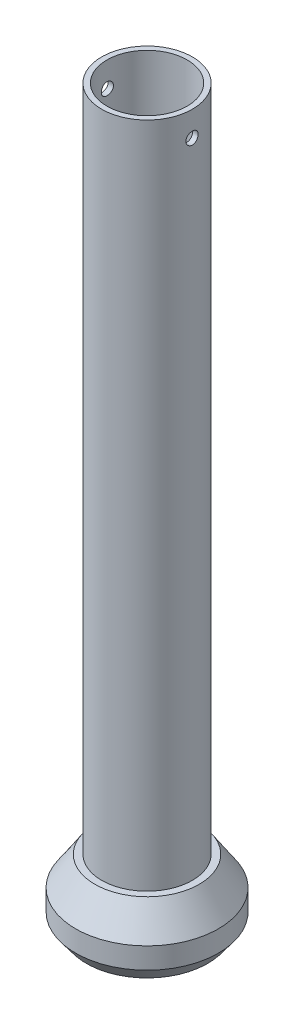
ISO-10303-21;
HEADER;
FILE_DESCRIPTION(('STEP AP214'),'2;1');
FILE_NAME('part.step','',(''),(''),'','','');
FILE_SCHEMA(('AUTOMOTIVE_DESIGN { 1 0 10303 214 1 1 1 1 }'));
ENDSEC;
DATA;
#1=APPLICATION_CONTEXT('core data for automotive mechanical design processes');
#2=APPLICATION_PROTOCOL_DEFINITION('international standard','automotive_design',2000,#1);
#3=PRODUCT_CONTEXT('',#1,'mechanical');
#4=PRODUCT('Part','Part','',(#3));
#5=PRODUCT_RELATED_PRODUCT_CATEGORY('part','',(#4));
#6=PRODUCT_DEFINITION_FORMATION('','',#4);
#7=PRODUCT_DEFINITION_CONTEXT('part definition',#1,'design');
#8=PRODUCT_DEFINITION('design','',#6,#7);
#9=PRODUCT_DEFINITION_SHAPE('','',#8);
#10=(LENGTH_UNIT() NAMED_UNIT(*) SI_UNIT(.MILLI.,.METRE.));
#11=(NAMED_UNIT(*) PLANE_ANGLE_UNIT() SI_UNIT($,.RADIAN.));
#12=(NAMED_UNIT(*) SI_UNIT($,.STERADIAN.) SOLID_ANGLE_UNIT());
#13=UNCERTAINTY_MEASURE_WITH_UNIT(LENGTH_MEASURE(1.E-05),#10,'distance_accuracy_value','');
#14=(GEOMETRIC_REPRESENTATION_CONTEXT(3) GLOBAL_UNCERTAINTY_ASSIGNED_CONTEXT((#13)) GLOBAL_UNIT_ASSIGNED_CONTEXT((#10,
#11,#12)) REPRESENTATION_CONTEXT('',''));
#15=CARTESIAN_POINT('',(0.,0.,0.));
#16=DIRECTION('',(0.,0.,1.));
#17=DIRECTION('',(1.,0.,0.));
#18=AXIS2_PLACEMENT_3D('',#15,#16,#17);
#19=CARTESIAN_POINT('',(0.,205.,0.));
#20=DIRECTION('',(0.,1.,0.));
#21=DIRECTION('',(0.,0.,1.));
#22=AXIS2_PLACEMENT_3D('',#19,#20,#21);
#23=PLANE('',#22);
#24=CARTESIAN_POINT('',(0.,205.,0.));
#25=DIRECTION('',(0.,1.,0.));
#26=DIRECTION('',(0.,0.,1.));
#27=AXIS2_PLACEMENT_3D('',#24,#25,#26);
#28=CIRCLE('',#27,12.7);
#29=CARTESIAN_POINT('',(0.,205.,12.7));
#30=VERTEX_POINT('',#29);
#31=EDGE_CURVE('E51',#30,#30,#28,.T.);
#32=ORIENTED_EDGE('',*,*,#31,.T.);
#33=EDGE_LOOP('',(#32));
#34=FACE_BOUND('',#33,.T.);
#35=CARTESIAN_POINT('',(0.,205.,0.));
#36=DIRECTION('',(0.,1.,0.));
#37=DIRECTION('',(0.,0.,1.));
#38=AXIS2_PLACEMENT_3D('',#35,#36,#37);
#39=CIRCLE('',#38,11.227);
#40=CARTESIAN_POINT('',(0.,205.,11.227));
#41=VERTEX_POINT('',#40);
#42=EDGE_CURVE('E56',#41,#41,#39,.T.);
#43=ORIENTED_EDGE('',*,*,#42,.F.);
#44=EDGE_LOOP('',(#43));
#45=FACE_BOUND('',#44,.T.);
#46=ADVANCED_FACE('F37',(#34,#45),#23,.T.);
#47=CARTESIAN_POINT('',(0.,205.,0.));
#48=DIRECTION('',(0.,-1.,0.));
#49=DIRECTION('',(0.,0.,-1.));
#50=AXIS2_PLACEMENT_3D('',#47,#48,#49);
#51=CYLINDRICAL_SURFACE('',#50,12.7);
#52=CARTESIAN_POINT('',(-12.5857061780418,198.,-1.7));
#53=CARTESIAN_POINT('',(-12.5857076261126,198.095029666816,-1.69999599546855));
#54=CARTESIAN_POINT('',(-12.586794105083,198.190117319063,-1.69200488330093));
#55=CARTESIAN_POINT('',(-12.5910205530344,198.377642239913,-1.6602554155329));
#56=CARTESIAN_POINT('',(-12.5941626200755,198.470076699774,-1.6364809500999));
#57=CARTESIAN_POINT('',(-12.6021381253762,198.649553263829,-1.57388176357468));
#58=CARTESIAN_POINT('',(-12.6069703654311,198.736599136804,-1.53506770232083));
#59=CARTESIAN_POINT('',(-12.6177803097173,198.902927202906,-1.44351474256397));
#60=CARTESIAN_POINT('',(-12.6237578308764,198.982210633796,-1.39077806907157));
#61=CARTESIAN_POINT('',(-12.6362276350666,199.131285528651,-1.27251580485948));
#62=CARTESIAN_POINT('',(-12.6427226663171,199.201020119531,-1.20691880456126));
#63=CARTESIAN_POINT('',(-12.6554710168503,199.328526010816,-1.06495187276577));
#64=CARTESIAN_POINT('',(-12.6617243236826,199.38629669567,-0.988581387304166));
#65=CARTESIAN_POINT('',(-12.6733130119551,199.488441015213,-0.826875364963607));
#66=CARTESIAN_POINT('',(-12.6786448109588,199.532762849261,-0.741506828749704));
#67=CARTESIAN_POINT('',(-12.6877594440336,199.606419341233,-0.56445456998065));
#68=CARTESIAN_POINT('',(-12.6915423436867,199.635754633716,-0.472771114997931));
#69=CARTESIAN_POINT('',(-12.6971135793965,199.67843448987,-0.28627485488713));
#70=CARTESIAN_POINT('',(-12.6989137390241,199.691873880655,-0.191484109917456));
#71=CARTESIAN_POINT('',(-12.700357092509,199.702674509539,-0.0009768645664892));
#72=CARTESIAN_POINT('',(-12.700000382947,199.700036467558,0.0947395941713518));
#73=CARTESIAN_POINT('',(-12.6971797154939,199.678832721595,0.283735457543321));
#74=CARTESIAN_POINT('',(-12.6947292519761,199.660369012618,0.377026534973739));
#75=CARTESIAN_POINT('',(-12.6880115065981,199.608197709311,0.559174076179373));
#76=CARTESIAN_POINT('',(-12.6837441859857,199.574489789831,0.648030445320119));
#77=CARTESIAN_POINT('',(-12.6738489440843,199.492679804065,0.819099667713063));
#78=CARTESIAN_POINT('',(-12.6682168987378,199.444534001182,0.901291356683168));
#79=CARTESIAN_POINT('',(-12.6562215197963,199.335246783316,1.05646725720112));
#80=CARTESIAN_POINT('',(-12.6498581477781,199.274104685374,1.1294509845466));
#81=CARTESIAN_POINT('',(-12.6370525797161,199.139990226847,1.26473912878109));
#82=CARTESIAN_POINT('',(-12.6306101567354,199.066928919368,1.32695538198785));
#83=CARTESIAN_POINT('',(-12.6184216054738,198.911354407539,1.43825619734592));
#84=CARTESIAN_POINT('',(-12.6126754799944,198.828841165165,1.48734070666658));
#85=CARTESIAN_POINT('',(-12.6025302682549,198.656622034751,1.57099202270723));
#86=CARTESIAN_POINT('',(-12.5981318993661,198.566912348197,1.60555110159179));
#87=CARTESIAN_POINT('',(-12.5911937330922,198.382890685124,1.65908887825643));
#88=CARTESIAN_POINT('',(-12.5886538324654,198.288578964567,1.67806844151632));
#89=CARTESIAN_POINT('',(-12.5857393159955,198.098810969687,1.69979028597622));
#90=CARTESIAN_POINT('',(-12.5853481150033,198.003369177263,1.70265694176305));
#91=CARTESIAN_POINT('',(-12.5867313734562,197.813366659363,1.69240038418018));
#92=CARTESIAN_POINT('',(-12.5885057797721,197.71880591233,1.67927756308177));
#93=CARTESIAN_POINT('',(-12.5940051558249,197.533626631206,1.63751954099806));
#94=CARTESIAN_POINT('',(-12.5977224780065,197.442994138946,1.60894514416265));
#95=CARTESIAN_POINT('',(-12.6066826059145,197.267806255241,1.53715790190023));
#96=CARTESIAN_POINT('',(-12.6119254726155,197.18325110687,1.49394447135366));
#97=CARTESIAN_POINT('',(-12.6233854657903,197.022057134718,1.39380236985674));
#98=CARTESIAN_POINT('',(-12.6296082819452,196.945469175123,1.33679248719701));
#99=CARTESIAN_POINT('',(-12.6423094086052,196.802903912302,1.21078994456793));
#100=CARTESIAN_POINT('',(-12.6487877305313,196.73692708406,1.14179674848011));
#101=CARTESIAN_POINT('',(-12.6613211770068,196.617016757267,0.993241233798258));
#102=CARTESIAN_POINT('',(-12.6673732419207,196.563165220929,0.91361246189713));
#103=CARTESIAN_POINT('',(-12.6783259415851,196.469602550646,0.74636732792761));
#104=CARTESIAN_POINT('',(-12.6832266024078,196.429891096507,0.658751146786749));
#105=CARTESIAN_POINT('',(-12.6913108048035,196.365869742668,0.478285126969215));
#106=CARTESIAN_POINT('',(-12.6944995274523,196.341513332428,0.38545202993557));
#107=CARTESIAN_POINT('',(-12.6988221676126,196.308742392541,0.196968172328185));
#108=CARTESIAN_POINT('',(-12.6999561920936,196.300327032986,0.101317558700326));
#109=CARTESIAN_POINT('',(-12.7000409696867,196.299694168376,-0.0892876883330756));
#110=CARTESIAN_POINT('',(-12.6990087128469,196.307350612995,-0.18424192012823));
#111=CARTESIAN_POINT('',(-12.6949108372525,196.338375975885,-0.371500721255274));
#112=CARTESIAN_POINT('',(-12.6918452214441,196.361744871388,-0.46380529442634));
#113=CARTESIAN_POINT('',(-12.6840234739014,196.423490432774,-0.64312196229775));
#114=CARTESIAN_POINT('',(-12.6792681251201,196.461860148715,-0.730136486358439));
#115=CARTESIAN_POINT('',(-12.6685920444935,196.55250504872,-0.896511854786507));
#116=CARTESIAN_POINT('',(-12.6626712906356,196.604780495448,-0.975872554543088));
#117=CARTESIAN_POINT('',(-12.6502690336374,196.722215967273,-1.12533009996931));
#118=CARTESIAN_POINT('',(-12.6437836617612,196.787469587731,-1.19535308777107));
#119=CARTESIAN_POINT('',(-12.6310133503666,196.928813267282,-1.32350300214569));
#120=CARTESIAN_POINT('',(-12.6247284585022,197.004905879654,-1.38162711788447));
#121=CARTESIAN_POINT('',(-12.6130409811272,197.166158264974,-1.48455393730156));
#122=CARTESIAN_POINT('',(-12.6076424278439,197.251356714549,-1.52929648246331));
#123=CARTESIAN_POINT('',(-12.5983860699093,197.428085594883,-1.60377348439465));
#124=CARTESIAN_POINT('',(-12.5945266159548,197.519609123555,-1.63352401571545));
#125=CARTESIAN_POINT('',(-12.5897075098459,197.676321974686,-1.6701727269858));
#126=CARTESIAN_POINT('',(-12.5882146420675,197.740529188185,-1.68134153185223));
#127=CARTESIAN_POINT('',(-12.586213484658,197.869815200767,-1.69625650592259));
#128=CARTESIAN_POINT('',(-12.5857051859505,197.934893991809,-1.70000274355436));
#129=CARTESIAN_POINT('',(-12.5857061780418,198.,-1.7));
#130=B_SPLINE_CURVE_WITH_KNOTS('',3,(#52,#53,#54,#55,#56,#57,#58,#59,#60,#61,#62,#63,#64,#65,
#66,#67,#68,#69,#70,#71,#72,#73,#74,#75,#76,#77,#78,#79,#80,#81,#82,#83,#84,#85,#86,#87,#88,#89,
#90,#91,#92,#93,#94,#95,#96,#97,#98,#99,#100,#101,#102,#103,#104,#105,#106,#107,#108,#109,#110,
#111,#112,#113,#114,#115,#116,#117,#118,#119,#120,#121,#122,#123,#124,#125,#126,#127,#128,#129),
.UNSPECIFIED.,.T.,.F.,(4,2,2,2,2,2,2,2,2,2,2,2,2,2,2,2,2,2,2,2,2,2,2,2,2,2,2,2,2,2,2,2,2,2,2,2,
2,2,4),(0.,0.284851116940149,0.569993425080827,0.854933997268417,1.1398290598633,
1.42635331147528,1.71289230131793,2.00052133305377,2.28813818501126,2.5740304611665,
2.85990993566352,3.14396067861157,3.42801748047186,3.71294361897851,3.99788473413996,
4.28505862843808,4.57223367805557,4.8595613180565,5.1468729952308,5.43196385260401,
5.71704771595802,6.00101781204263,6.28499925970048,6.57069483930796,6.85640320387246,
7.14398844343264,7.43156717034728,7.71827058024368,8.00495906367925,8.28940746822011,
8.57385546059371,8.85817182292123,9.14249355604939,9.42894538821395,9.71546481013103,
10.0032535955277,10.290733151532,10.4858899982897,10.6810450459092),.UNSPECIFIED.);
#131=CARTESIAN_POINT('',(-12.5857061780418,198.,-1.7));
#132=VERTEX_POINT('',#131);
#133=EDGE_CURVE('E86',#132,#132,#130,.T.);
#134=ORIENTED_EDGE('',*,*,#133,.T.);
#135=EDGE_LOOP('',(#134));
#136=FACE_BOUND('',#135,.T.);
#137=CARTESIAN_POINT('',(12.5857061780418,198.,-1.7));
#138=CARTESIAN_POINT('',(12.5857076261126,197.904970333184,-1.69999599546855));
#139=CARTESIAN_POINT('',(12.586794105083,197.809882680937,-1.69200488330093));
#140=CARTESIAN_POINT('',(12.5910205530343,197.622357760087,-1.6602554155329));
#141=CARTESIAN_POINT('',(12.5941626200755,197.529923300226,-1.6364809500999));
#142=CARTESIAN_POINT('',(12.6021381253762,197.350446736171,-1.57388176357468));
#143=CARTESIAN_POINT('',(12.6069703654311,197.263400863196,-1.53506770232083));
#144=CARTESIAN_POINT('',(12.6177803097173,197.097072797094,-1.44351474256397));
#145=CARTESIAN_POINT('',(12.6237578308764,197.017789366204,-1.39077806907157));
#146=CARTESIAN_POINT('',(12.6362276350666,196.868714471349,-1.27251580485948));
#147=CARTESIAN_POINT('',(12.6427226663171,196.798979880469,-1.20691880456126));
#148=CARTESIAN_POINT('',(12.6554710168503,196.671473989184,-1.06495187276577));
#149=CARTESIAN_POINT('',(12.6617243236826,196.61370330433,-0.988581387304165));
#150=CARTESIAN_POINT('',(12.6733130119551,196.511558984787,-0.826875364963607));
#151=CARTESIAN_POINT('',(12.6786448109588,196.467237150739,-0.741506828749704));
#152=CARTESIAN_POINT('',(12.6877594440336,196.393580658767,-0.56445456998065));
#153=CARTESIAN_POINT('',(12.6915423436867,196.364245366283,-0.472771114997931));
#154=CARTESIAN_POINT('',(12.6971135793965,196.32156551013,-0.286274854887131));
#155=CARTESIAN_POINT('',(12.6989137390241,196.308126119345,-0.191484109917458));
#156=CARTESIAN_POINT('',(12.700357092509,196.297325490461,-0.000976864566491463));
#157=CARTESIAN_POINT('',(12.700000382947,196.299963532442,0.0947395941713504));
#158=CARTESIAN_POINT('',(12.6971797154939,196.321167278405,0.283735457543321));
#159=CARTESIAN_POINT('',(12.6947292519761,196.339630987382,0.377026534973739));
#160=CARTESIAN_POINT('',(12.6880115065981,196.391802290689,0.559174076179373));
#161=CARTESIAN_POINT('',(12.6837441859857,196.425510210169,0.648030445320117));
#162=CARTESIAN_POINT('',(12.6738489440843,196.507320195935,0.819099667713058));
#163=CARTESIAN_POINT('',(12.6682168987378,196.555465998818,0.901291356683161));
#164=CARTESIAN_POINT('',(12.6562215197963,196.664753216683,1.05646725720112));
#165=CARTESIAN_POINT('',(12.6498581477781,196.725895314626,1.12945098454659));
#166=CARTESIAN_POINT('',(12.6370525797161,196.860009773152,1.26473912878109));
#167=CARTESIAN_POINT('',(12.6306101567354,196.933071080632,1.32695538198785));
#168=CARTESIAN_POINT('',(12.6184216054738,197.088645592461,1.43825619734592));
#169=CARTESIAN_POINT('',(12.6126754799944,197.171158834835,1.48734070666658));
#170=CARTESIAN_POINT('',(12.6025302682549,197.343377965249,1.57099202270722));
#171=CARTESIAN_POINT('',(12.5981318993661,197.433087651803,1.60555110159179));
#172=CARTESIAN_POINT('',(12.5911937330922,197.617109314876,1.65908887825642));
#173=CARTESIAN_POINT('',(12.5886538324654,197.711421035432,1.67806844151632));
#174=CARTESIAN_POINT('',(12.5857393159955,197.901189030312,1.69979028597622));
#175=CARTESIAN_POINT('',(12.5853481150033,197.996630822737,1.70265694176305));
#176=CARTESIAN_POINT('',(12.5867313734562,198.186633340637,1.69240038418018));
#177=CARTESIAN_POINT('',(12.5885057797721,198.28119408767,1.67927756308177));
#178=CARTESIAN_POINT('',(12.5940051558249,198.466373368794,1.63751954099806));
#179=CARTESIAN_POINT('',(12.5977224780065,198.557005861054,1.60894514416265));
#180=CARTESIAN_POINT('',(12.6066826059145,198.732193744759,1.53715790190023));
#181=CARTESIAN_POINT('',(12.6119254726155,198.81674889313,1.49394447135366));
#182=CARTESIAN_POINT('',(12.6233854657903,198.977942865282,1.39380236985674));
#183=CARTESIAN_POINT('',(12.6296082819452,199.054530824877,1.33679248719701));
#184=CARTESIAN_POINT('',(12.6423094086052,199.197096087698,1.21078994456793));
#185=CARTESIAN_POINT('',(12.6487877305313,199.26307291594,1.14179674848011));
#186=CARTESIAN_POINT('',(12.6613211770068,199.382983242733,0.993241233798258));
#187=CARTESIAN_POINT('',(12.6673732419207,199.436834779071,0.91361246189713));
#188=CARTESIAN_POINT('',(12.6783259415851,199.530397449354,0.74636732792761));
#189=CARTESIAN_POINT('',(12.6832266024078,199.570108903493,0.658751146786749));
#190=CARTESIAN_POINT('',(12.6913108048035,199.634130257332,0.478285126969215));
#191=CARTESIAN_POINT('',(12.6944995274523,199.658486667572,0.38545202993557));
#192=CARTESIAN_POINT('',(12.6988221676126,199.691257607459,0.196968172328185));
#193=CARTESIAN_POINT('',(12.6999561920936,199.699672967014,0.101317558700326));
#194=CARTESIAN_POINT('',(12.7000409696867,199.700305831624,-0.0892876883330755));
#195=CARTESIAN_POINT('',(12.6990087128469,199.692649387005,-0.18424192012823));
#196=CARTESIAN_POINT('',(12.6949108372525,199.661624024115,-0.371500721255274));
#197=CARTESIAN_POINT('',(12.6918452214441,199.638255128612,-0.463805294426339));
#198=CARTESIAN_POINT('',(12.6840234739014,199.576509567226,-0.64312196229775));
#199=CARTESIAN_POINT('',(12.6792681251201,199.538139851284,-0.730136486358439));
#200=CARTESIAN_POINT('',(12.6685920444935,199.447494951279,-0.896511854786506));
#201=CARTESIAN_POINT('',(12.6626712906356,199.395219504552,-0.975872554543086));
#202=CARTESIAN_POINT('',(12.6502690336374,199.277784032727,-1.1253300999693));
#203=CARTESIAN_POINT('',(12.6437836617612,199.212530412269,-1.19535308777106));
#204=CARTESIAN_POINT('',(12.6310133503666,199.071186732718,-1.32350300214568));
#205=CARTESIAN_POINT('',(12.6247284585022,198.995094120346,-1.38162711788447));
#206=CARTESIAN_POINT('',(12.6130409811272,198.833841735026,-1.48455393730156));
#207=CARTESIAN_POINT('',(12.6076424278439,198.748643285451,-1.52929648246331));
#208=CARTESIAN_POINT('',(12.5983860699093,198.571914405117,-1.60377348439465));
#209=CARTESIAN_POINT('',(12.5945266159548,198.480390876445,-1.63352401571545));
#210=CARTESIAN_POINT('',(12.5897075098459,198.323678025314,-1.6701727269858));
#211=CARTESIAN_POINT('',(12.5882146420675,198.259470811815,-1.68134153185223));
#212=CARTESIAN_POINT('',(12.586213484658,198.130184799233,-1.69625650592259));
#213=CARTESIAN_POINT('',(12.5857051859505,198.065106008191,-1.70000274355436));
#214=CARTESIAN_POINT('',(12.5857061780418,198.,-1.7));
#215=B_SPLINE_CURVE_WITH_KNOTS('',3,(#137,#138,#139,#140,#141,#142,#143,#144,#145,#146,#147,
#148,#149,#150,#151,#152,#153,#154,#155,#156,#157,#158,#159,#160,#161,#162,#163,#164,#165,#166,
#167,#168,#169,#170,#171,#172,#173,#174,#175,#176,#177,#178,#179,#180,#181,#182,#183,#184,#185,
#186,#187,#188,#189,#190,#191,#192,#193,#194,#195,#196,#197,#198,#199,#200,#201,#202,#203,#204,
#205,#206,#207,#208,#209,#210,#211,#212,#213,#214),.UNSPECIFIED.,.T.,.F.,(4,2,2,2,2,2,2,2,2,2,2,
2,2,2,2,2,2,2,2,2,2,2,2,2,2,2,2,2,2,2,2,2,2,2,2,2,2,2,4),(0.,0.284851116940149,
0.569993425080826,0.854933997268417,1.1398290598633,1.42635331147528,1.71289230131793,
2.00052133305377,2.28813818501126,2.5740304611665,2.85990993566352,3.14396067861157,
3.42801748047186,3.71294361897848,3.99788473413996,4.28505862843808,4.57223367805557,
4.85956131805647,5.14687299523081,5.43196385260402,5.71704771595802,6.00101781204264,
6.28499925970048,6.57069483930797,6.85640320387246,7.14398844343265,7.43156717034729,
7.71827058024369,8.00495906367925,8.28940746822011,8.57385546059372,8.85817182292123,
9.14249355604939,9.42894538821392,9.71546481013103,10.0032535955277,10.290733151532,
10.4858899982897,10.6810450459092),.UNSPECIFIED.);
#216=CARTESIAN_POINT('',(12.5857061780418,198.,-1.7));
#217=VERTEX_POINT('',#216);
#218=EDGE_CURVE('E81',#217,#217,#215,.T.);
#219=ORIENTED_EDGE('',*,*,#218,.T.);
#220=EDGE_LOOP('',(#219));
#221=FACE_BOUND('',#220,.T.);
#222=CARTESIAN_POINT('',(0.,18.,0.));
#223=DIRECTION('',(0.,1.,0.));
#224=DIRECTION('',(0.,0.,1.));
#225=AXIS2_PLACEMENT_3D('',#222,#223,#224);
#226=CIRCLE('',#225,12.7);
#227=CARTESIAN_POINT('',(0.,18.,12.7));
#228=VERTEX_POINT('',#227);
#229=EDGE_CURVE('E104',#228,#228,#226,.T.);
#230=ORIENTED_EDGE('',*,*,#229,.T.);
#231=EDGE_LOOP('',(#230));
#232=FACE_BOUND('',#231,.T.);
#233=ORIENTED_EDGE('',*,*,#31,.F.);
#234=EDGE_LOOP('',(#233));
#235=FACE_BOUND('',#234,.T.);
#236=ADVANCED_FACE('F39',(#136,#221,#232,#235),#51,.T.);
#237=CARTESIAN_POINT('',(0.,205.,0.));
#238=DIRECTION('',(0.,-1.,0.));
#239=DIRECTION('',(0.,0.,-1.));
#240=AXIS2_PLACEMENT_3D('',#237,#238,#239);
#241=CYLINDRICAL_SURFACE('',#240,11.227);
#242=CARTESIAN_POINT('',(-11.0975460801026,198.,-1.7));
#243=CARTESIAN_POINT('',(-11.0975476780079,198.094900607206,-1.69999608833353));
#244=CARTESIAN_POINT('',(-11.0987765667018,198.18985603763,-1.69202654393414));
#245=CARTESIAN_POINT('',(-11.1035559209667,198.377111278822,-1.66036783735331));
#246=CARTESIAN_POINT('',(-11.1071086408957,198.469408419906,-1.63666341036773));
#247=CARTESIAN_POINT('',(-11.1161242508861,198.648609541566,-1.5742610433209));
#248=CARTESIAN_POINT('',(-11.121585664094,198.735517630889,-1.53557469304523));
#249=CARTESIAN_POINT('',(-11.1338015445046,198.901596842924,-1.4443340638145));
#250=CARTESIAN_POINT('',(-11.140555836312,198.980769012913,-1.391781665598));
#251=CARTESIAN_POINT('',(-11.154658027372,199.129786756436,-1.27384299149691));
#252=CARTESIAN_POINT('',(-11.1620098973089,199.199560084195,-1.20836589497708));
#253=CARTESIAN_POINT('',(-11.1764434477108,199.327173349079,-1.06663260111831));
#254=CARTESIAN_POINT('',(-11.1835251132103,199.385012626004,-0.990375807832299));
#255=CARTESIAN_POINT('',(-11.1966619235425,199.487382881499,-0.828784508643873));
#256=CARTESIAN_POINT('',(-11.2027118694016,199.531847273453,-0.743407360539824));
#257=CARTESIAN_POINT('',(-11.2130595804229,199.605778212158,-0.566289670144371));
#258=CARTESIAN_POINT('',(-11.2173574398896,199.635245566131,-0.474549470649573));
#259=CARTESIAN_POINT('',(-11.2236887124903,199.678126791215,-0.28805407071714));
#260=CARTESIAN_POINT('',(-11.2257391869926,199.691661675119,-0.19332728355773));
#261=CARTESIAN_POINT('',(-11.2274031427348,199.702669551904,-0.00292643326980734));
#262=CARTESIAN_POINT('',(-11.227016761904,199.70014345386,0.0927475759385745));
#263=CARTESIAN_POINT('',(-11.2238641636252,199.67919648073,0.281501269245245));
#264=CARTESIAN_POINT('',(-11.2211174400345,199.660905800225,0.374595773550772));
#265=CARTESIAN_POINT('',(-11.2135744993549,199.609153283949,0.556378762110231));
#266=CARTESIAN_POINT('',(-11.208778228703,199.575691051681,0.645067131146008));
#267=CARTESIAN_POINT('',(-11.1976416289034,199.494412334356,0.815913818317857));
#268=CARTESIAN_POINT('',(-11.1912954319102,199.446541134612,0.898045708390201));
#269=CARTESIAN_POINT('',(-11.1777660782417,199.337843328927,1.05315985724655));
#270=CARTESIAN_POINT('',(-11.1705828654555,199.277015854213,1.12614150194563));
#271=CARTESIAN_POINT('',(-11.1560954199135,199.143407143393,1.26165107676896));
#272=CARTESIAN_POINT('',(-11.1487906957586,199.07051222669,1.32406692106415));
#273=CARTESIAN_POINT('',(-11.134953685821,198.915223822377,1.43579763058257));
#274=CARTESIAN_POINT('',(-11.1284214049685,198.832830274148,1.48511241218976));
#275=CARTESIAN_POINT('',(-11.1168689842971,198.660765551837,1.56925683744556));
#276=CARTESIAN_POINT('',(-11.1118500649074,198.571088577715,1.60407479890779));
#277=CARTESIAN_POINT('',(-11.1039141032747,198.387066712189,1.65812360717463));
#278=CARTESIAN_POINT('',(-11.1009969099352,198.292722156865,1.67735557449415));
#279=CARTESIAN_POINT('',(-11.0976233963631,198.103040927125,1.69953241165985));
#280=CARTESIAN_POINT('',(-11.0971430591578,198.007723250336,1.70263624331223));
#281=CARTESIAN_POINT('',(-11.0986338623088,197.817929034249,1.69289064866793));
#282=CARTESIAN_POINT('',(-11.1006049250986,197.723452468433,1.68004172714399));
#283=CARTESIAN_POINT('',(-11.1067543658382,197.538515804464,1.63889023881176));
#284=CARTESIAN_POINT('',(-11.110921408357,197.448037642868,1.6106670077021));
#285=CARTESIAN_POINT('',(-11.1209839249317,197.273096164823,1.5396506369624));
#286=CARTESIAN_POINT('',(-11.1268794858371,197.188633150868,1.49685676521379));
#287=CARTESIAN_POINT('',(-11.1397912755189,197.02740739992,1.39753249813958));
#288=CARTESIAN_POINT('',(-11.1468157510136,196.950708675671,1.34089928626849));
#289=CARTESIAN_POINT('',(-11.1611691078928,196.807847044078,1.21564673104491));
#290=CARTESIAN_POINT('',(-11.1684980068098,196.741684744618,1.14702669660692));
#291=CARTESIAN_POINT('',(-11.1827095618661,196.621202402332,0.999047960914396));
#292=CARTESIAN_POINT('',(-11.1895878971168,196.566987760573,0.91960296709246));
#293=CARTESIAN_POINT('',(-11.2020560000026,196.472674351277,0.752640911062378));
#294=CARTESIAN_POINT('',(-11.2076458034326,196.432575191602,0.665124073180394));
#295=CARTESIAN_POINT('',(-11.2168881027707,196.367799068304,0.484830385695954));
#296=CARTESIAN_POINT('',(-11.2205478048291,196.343064676943,0.392074553827564));
#297=CARTESIAN_POINT('',(-11.2255478186098,196.309534430511,0.203666383805654));
#298=CARTESIAN_POINT('',(-11.2268882865612,196.300737501852,0.108014241196315));
#299=CARTESIAN_POINT('',(-11.2270971797654,196.299358478704,-0.0824494664253017));
#300=CARTESIAN_POINT('',(-11.2259901806362,196.306615186159,-0.177259876717656));
#301=CARTESIAN_POINT('',(-11.221478129754,196.336791668163,-0.364295710816036));
#302=CARTESIAN_POINT('',(-11.218073085768,196.359711389774,-0.456521143357784));
#303=CARTESIAN_POINT('',(-11.2093457995206,196.420505719045,-0.635723397712592));
#304=CARTESIAN_POINT('',(-11.2040250152027,196.458368956282,-0.722704152293476));
#305=CARTESIAN_POINT('',(-11.1920503713569,196.547958263247,-0.889103306289192));
#306=CARTESIAN_POINT('',(-11.1853964668985,196.599684800233,-0.968521450686062));
#307=CARTESIAN_POINT('',(-11.1714156986471,196.716114325478,-1.11835815241303));
#308=CARTESIAN_POINT('',(-11.1640830270465,196.780936255532,-1.18868375358987));
#309=CARTESIAN_POINT('',(-11.1496138901503,196.921466280419,-1.31751773337707));
#310=CARTESIAN_POINT('',(-11.1424774712945,196.99717692592,-1.37602333542433));
#311=CARTESIAN_POINT('',(-11.1291649408665,197.157846143617,-1.47985839424944));
#312=CARTESIAN_POINT('',(-11.1229945702165,197.242855253219,-1.5251103769619));
#313=CARTESIAN_POINT('',(-11.1123801217587,197.419321262151,-1.60062607285991));
#314=CARTESIAN_POINT('',(-11.1079342589065,197.510771377854,-1.63090529337883));
#315=CARTESIAN_POINT('',(-11.1022960145512,197.668856533695,-1.66876813992151));
#316=CARTESIAN_POINT('',(-11.1005242705366,197.734516687861,-1.68046209689796));
#317=CARTESIAN_POINT('',(-11.0981487501953,197.866775562523,-1.69607934819052));
#318=CARTESIAN_POINT('',(-11.0975449582804,197.933374270479,-1.7000027462167));
#319=CARTESIAN_POINT('',(-11.0975460801026,198.,-1.7));
#320=B_SPLINE_CURVE_WITH_KNOTS('',3,(#242,#243,#244,#245,#246,#247,#248,#249,#250,#251,#252,
#253,#254,#255,#256,#257,#258,#259,#260,#261,#262,#263,#264,#265,#266,#267,#268,#269,#270,#271,
#272,#273,#274,#275,#276,#277,#278,#279,#280,#281,#282,#283,#284,#285,#286,#287,#288,#289,#290,
#291,#292,#293,#294,#295,#296,#297,#298,#299,#300,#301,#302,#303,#304,#305,#306,#307,#308,#309,
#310,#311,#312,#313,#314,#315,#316,#317,#318,#319),.UNSPECIFIED.,.T.,.F.,(4,2,2,2,2,2,2,2,2,2,2,
2,2,2,2,2,2,2,2,2,2,2,2,2,2,2,2,2,2,2,2,2,2,2,2,2,2,2,4),(0.,0.284458287792611,
0.569192939803246,0.853707764045108,1.13818401758704,1.42473538819387,1.71130260676804,
1.99927374105228,2.28722937350229,2.57298347133351,2.85872139522949,3.14212187033808,
3.42552975232583,3.71002768526764,3.99454470102951,4.28191286912159,4.56928287126448,
4.85688400289565,5.14446445634956,5.42920501421058,5.71393656261686,5.99721254710745,
6.28050276722631,6.56596528028133,6.85144425676124,7.13934896044924,7.4272456653321,
7.71405974181402,8.00085449705531,8.28478256700812,8.56870967733327,8.85242116461984,
9.13614221552552,9.42256651438614,9.7090580173824,9.99719223073263,10.2850273943128,
10.4847362734486,10.6844424871442),.UNSPECIFIED.);
#321=CARTESIAN_POINT('',(-11.0975460801026,198.,-1.7));
#322=VERTEX_POINT('',#321);
#323=EDGE_CURVE('E42',#322,#322,#320,.T.);
#324=ORIENTED_EDGE('',*,*,#323,.F.);
#325=EDGE_LOOP('',(#324));
#326=FACE_BOUND('',#325,.T.);
#327=CARTESIAN_POINT('',(11.0975460801026,198.,-1.7));
#328=CARTESIAN_POINT('',(11.0975476780079,197.905099392794,-1.69999608833353));
#329=CARTESIAN_POINT('',(11.0987765667018,197.81014396237,-1.69202654393414));
#330=CARTESIAN_POINT('',(11.1035559209667,197.622888721178,-1.6603678373533));
#331=CARTESIAN_POINT('',(11.1071086408957,197.530591580094,-1.63666341036772));
#332=CARTESIAN_POINT('',(11.1161242508861,197.351390458434,-1.57426104332089));
#333=CARTESIAN_POINT('',(11.121585664094,197.264482369111,-1.53557469304522));
#334=CARTESIAN_POINT('',(11.1338015445046,197.098403157076,-1.44433406381448));
#335=CARTESIAN_POINT('',(11.140555836312,197.019230987087,-1.39178166559799));
#336=CARTESIAN_POINT('',(11.154658027372,196.870213243564,-1.27384299149691));
#337=CARTESIAN_POINT('',(11.1620098973089,196.800439915804,-1.20836589497708));
#338=CARTESIAN_POINT('',(11.1764434477108,196.672826650921,-1.06663260111831));
#339=CARTESIAN_POINT('',(11.1835251132103,196.614987373996,-0.990375807832298));
#340=CARTESIAN_POINT('',(11.1966619235425,196.512617118501,-0.828784508643873));
#341=CARTESIAN_POINT('',(11.2027118694016,196.468152726547,-0.743407360539824));
#342=CARTESIAN_POINT('',(11.2130595804229,196.394221787842,-0.566289670144371));
#343=CARTESIAN_POINT('',(11.2173574398896,196.364754433869,-0.474549470649573));
#344=CARTESIAN_POINT('',(11.2236887124903,196.321873208785,-0.28805407071714));
#345=CARTESIAN_POINT('',(11.2257391869926,196.308338324881,-0.19332728355773));
#346=CARTESIAN_POINT('',(11.2274031427348,196.297330448096,-0.00292643326980703));
#347=CARTESIAN_POINT('',(11.227016761904,196.29985654614,0.0927475759385749));
#348=CARTESIAN_POINT('',(11.2238641636252,196.32080351927,0.281501269245243));
#349=CARTESIAN_POINT('',(11.2211174400345,196.339094199775,0.374595773550767));
#350=CARTESIAN_POINT('',(11.2135744993549,196.390846716051,0.556378762110226));
#351=CARTESIAN_POINT('',(11.208778228703,196.424308948319,0.645067131146006));
#352=CARTESIAN_POINT('',(11.1976416289034,196.505587665644,0.815913818317858));
#353=CARTESIAN_POINT('',(11.1912954319102,196.553458865388,0.898045708390201));
#354=CARTESIAN_POINT('',(11.1777660782417,196.662156671073,1.05315985724655));
#355=CARTESIAN_POINT('',(11.1705828654555,196.722984145787,1.12614150194563));
#356=CARTESIAN_POINT('',(11.1560954199135,196.856592856607,1.26165107676896));
#357=CARTESIAN_POINT('',(11.1487906957586,196.92948777331,1.32406692106414));
#358=CARTESIAN_POINT('',(11.134953685821,197.084776177623,1.43579763058257));
#359=CARTESIAN_POINT('',(11.1284214049685,197.167169725852,1.48511241218977));
#360=CARTESIAN_POINT('',(11.1168689842971,197.339234448163,1.56925683744557));
#361=CARTESIAN_POINT('',(11.1118500649074,197.428911422285,1.60407479890779));
#362=CARTESIAN_POINT('',(11.1039141032747,197.612933287811,1.65812360717463));
#363=CARTESIAN_POINT('',(11.1009969099352,197.707277843135,1.67735557449415));
#364=CARTESIAN_POINT('',(11.0976233963631,197.896959072875,1.69953241165985));
#365=CARTESIAN_POINT('',(11.0971430591578,197.992276749664,1.70263624331223));
#366=CARTESIAN_POINT('',(11.0986338623088,198.182070965751,1.69289064866793));
#367=CARTESIAN_POINT('',(11.1006049250986,198.276547531567,1.68004172714399));
#368=CARTESIAN_POINT('',(11.1067543658382,198.461484195536,1.63889023881176));
#369=CARTESIAN_POINT('',(11.110921408357,198.551962357132,1.6106670077021));
#370=CARTESIAN_POINT('',(11.1209839249317,198.726903835177,1.5396506369624));
#371=CARTESIAN_POINT('',(11.1268794858371,198.811366849132,1.49685676521379));
#372=CARTESIAN_POINT('',(11.1397912755189,198.97259260008,1.39753249813958));
#373=CARTESIAN_POINT('',(11.1468157510136,199.049291324329,1.34089928626849));
#374=CARTESIAN_POINT('',(11.1611691078928,199.192152955922,1.21564673104491));
#375=CARTESIAN_POINT('',(11.1684980068098,199.258315255382,1.14702669660692));
#376=CARTESIAN_POINT('',(11.1827095618661,199.378797597668,0.999047960914399));
#377=CARTESIAN_POINT('',(11.1895878971168,199.433012239427,0.919602967092466));
#378=CARTESIAN_POINT('',(11.2020560000026,199.527325648723,0.752640911062382));
#379=CARTESIAN_POINT('',(11.2076458034326,199.567424808398,0.66512407318039));
#380=CARTESIAN_POINT('',(11.2168881027707,199.632200931696,0.484830385695944));
#381=CARTESIAN_POINT('',(11.2205478048291,199.656935323056,0.392074553827556));
#382=CARTESIAN_POINT('',(11.2255478186098,199.690465569489,0.20366638380565));
#383=CARTESIAN_POINT('',(11.2268882865612,199.699262498148,0.108014241196312));
#384=CARTESIAN_POINT('',(11.2270971797654,199.700641521296,-0.0824494664253022));
#385=CARTESIAN_POINT('',(11.2259901806362,199.693384813841,-0.177259876717655));
#386=CARTESIAN_POINT('',(11.221478129754,199.663208331837,-0.364295710816034));
#387=CARTESIAN_POINT('',(11.218073085768,199.640288610226,-0.456521143357783));
#388=CARTESIAN_POINT('',(11.2093457995206,199.579494280955,-0.635723397712592));
#389=CARTESIAN_POINT('',(11.2040250152027,199.541631043718,-0.722704152293476));
#390=CARTESIAN_POINT('',(11.1920503713569,199.452041736753,-0.889103306289192));
#391=CARTESIAN_POINT('',(11.1853964668985,199.400315199767,-0.968521450686062));
#392=CARTESIAN_POINT('',(11.1714156986471,199.283885674522,-1.11835815241303));
#393=CARTESIAN_POINT('',(11.1640830270465,199.219063744468,-1.18868375358987));
#394=CARTESIAN_POINT('',(11.1496138901503,199.078533719581,-1.31751773337707));
#395=CARTESIAN_POINT('',(11.1424774712945,199.00282307408,-1.37602333542433));
#396=CARTESIAN_POINT('',(11.1291649408665,198.842153856383,-1.47985839424944));
#397=CARTESIAN_POINT('',(11.1229945702165,198.757144746781,-1.5251103769619));
#398=CARTESIAN_POINT('',(11.1123801217587,198.580678737849,-1.60062607285991));
#399=CARTESIAN_POINT('',(11.1079342589065,198.489228622146,-1.63090529337883));
#400=CARTESIAN_POINT('',(11.1022960145512,198.331143466305,-1.66876813992151));
#401=CARTESIAN_POINT('',(11.1005242705366,198.265483312139,-1.68046209689796));
#402=CARTESIAN_POINT('',(11.0981487501953,198.133224437477,-1.69607934819052));
#403=CARTESIAN_POINT('',(11.0975449582804,198.066625729521,-1.7000027462167));
#404=CARTESIAN_POINT('',(11.0975460801026,198.,-1.7));
#405=B_SPLINE_CURVE_WITH_KNOTS('',3,(#327,#328,#329,#330,#331,#332,#333,#334,#335,#336,#337,
#338,#339,#340,#341,#342,#343,#344,#345,#346,#347,#348,#349,#350,#351,#352,#353,#354,#355,#356,
#357,#358,#359,#360,#361,#362,#363,#364,#365,#366,#367,#368,#369,#370,#371,#372,#373,#374,#375,
#376,#377,#378,#379,#380,#381,#382,#383,#384,#385,#386,#387,#388,#389,#390,#391,#392,#393,#394,
#395,#396,#397,#398,#399,#400,#401,#402,#403,#404),.UNSPECIFIED.,.T.,.F.,(4,2,2,2,2,2,2,2,2,2,2,
2,2,2,2,2,2,2,2,2,2,2,2,2,2,2,2,2,2,2,2,2,2,2,2,2,2,2,4),(0.,0.284458287792639,
0.569192939803246,0.853707764045143,1.13818401758703,1.42473538819387,1.71130260676804,
1.99927374105228,2.28722937350229,2.57298347133351,2.85872139522949,3.14212187033807,
3.42552975232583,3.71002768526764,3.99454470102951,4.28191286912158,4.56928287126451,
4.85688400289565,5.14446445634955,5.42920501421058,5.71393656261686,5.99721254710744,
6.28050276722631,6.56596528028133,6.85144425676124,7.13934896044923,7.42724566533211,
7.71405974181403,8.00085449705531,8.28478256700811,8.56870967733326,8.85242116461984,
9.13614221552552,9.42256651438614,9.70905801738239,9.99719223073262,10.2850273943128,
10.4847362734486,10.6844424871441),.UNSPECIFIED.);
#406=CARTESIAN_POINT('',(11.0975460801026,198.,-1.7));
#407=VERTEX_POINT('',#406);
#408=EDGE_CURVE('E59',#407,#407,#405,.T.);
#409=ORIENTED_EDGE('',*,*,#408,.F.);
#410=EDGE_LOOP('',(#409));
#411=FACE_BOUND('',#410,.T.);
#412=CARTESIAN_POINT('',(0.,18.,0.));
#413=DIRECTION('',(0.,1.,0.));
#414=DIRECTION('',(0.,0.,1.));
#415=AXIS2_PLACEMENT_3D('',#412,#413,#414);
#416=CIRCLE('',#415,11.227);
#417=CARTESIAN_POINT('',(0.,18.,11.227));
#418=VERTEX_POINT('',#417);
#419=EDGE_CURVE('E10',#418,#418,#416,.T.);
#420=ORIENTED_EDGE('',*,*,#419,.F.);
#421=EDGE_LOOP('',(#420));
#422=FACE_BOUND('',#421,.T.);
#423=ORIENTED_EDGE('',*,*,#42,.T.);
#424=EDGE_LOOP('',(#423));
#425=FACE_BOUND('',#424,.T.);
#426=ADVANCED_FACE('F64',(#326,#411,#422,#425),#241,.F.);
#427=CARTESIAN_POINT('',(14.605,18.,0.));
#428=DIRECTION('',(0.,1.,0.));
#429=DIRECTION('',(0.,0.,1.));
#430=AXIS2_PLACEMENT_3D('',#427,#428,#429);
#431=PLANE('',#430);
#432=ORIENTED_EDGE('',*,*,#419,.T.);
#433=EDGE_LOOP('',(#432));
#434=FACE_BOUND('',#433,.T.);
#435=ADVANCED_FACE('F127',(#434),#431,.T.);
#436=CARTESIAN_POINT('',(0.,0.,0.));
#437=DIRECTION('',(0.,1.,0.));
#438=DIRECTION('',(0.,0.,1.));
#439=AXIS2_PLACEMENT_3D('',#436,#437,#438);
#440=CONICAL_SURFACE('',#439,17.,0.643501108793284);
#441=CARTESIAN_POINT('',(0.,4.,0.));
#442=DIRECTION('',(0.,-1.,0.));
#443=DIRECTION('',(0.,0.,-1.));
#444=AXIS2_PLACEMENT_3D('',#441,#442,#443);
#445=CIRCLE('',#444,20.);
#446=CARTESIAN_POINT('',(0.,4.,-20.));
#447=VERTEX_POINT('',#446);
#448=EDGE_CURVE('E98',#447,#447,#445,.T.);
#449=ORIENTED_EDGE('',*,*,#448,.T.);
#450=EDGE_LOOP('',(#449));
#451=FACE_BOUND('',#450,.T.);
#452=CARTESIAN_POINT('',(0.,0.,0.));
#453=DIRECTION('',(0.,-1.,0.));
#454=DIRECTION('',(0.,0.,-1.));
#455=AXIS2_PLACEMENT_3D('',#452,#453,#454);
#456=CIRCLE('',#455,17.);
#457=CARTESIAN_POINT('',(0.,0.,-17.));
#458=VERTEX_POINT('',#457);
#459=EDGE_CURVE('E101',#458,#458,#456,.T.);
#460=ORIENTED_EDGE('',*,*,#459,.F.);
#461=EDGE_LOOP('',(#460));
#462=FACE_BOUND('',#461,.T.);
#463=ADVANCED_FACE('F130',(#451,#462),#440,.T.);
#464=CARTESIAN_POINT('',(0.,-10.,0.));
#465=DIRECTION('',(0.,-1.,0.));
#466=DIRECTION('',(0.,0.,-1.));
#467=AXIS2_PLACEMENT_3D('',#464,#465,#466);
#468=CYLINDRICAL_SURFACE('',#467,20.);
#469=CARTESIAN_POINT('',(0.,9.9,0.));
#470=DIRECTION('',(0.,-1.,0.));
#471=DIRECTION('',(0.,0.,-1.));
#472=AXIS2_PLACEMENT_3D('',#469,#470,#471);
#473=CIRCLE('',#472,20.);
#474=CARTESIAN_POINT('',(0.,9.9,-20.));
#475=VERTEX_POINT('',#474);
#476=EDGE_CURVE('E95',#475,#475,#473,.T.);
#477=ORIENTED_EDGE('',*,*,#476,.T.);
#478=EDGE_LOOP('',(#477));
#479=FACE_BOUND('',#478,.T.);
#480=ORIENTED_EDGE('',*,*,#448,.F.);
#481=EDGE_LOOP('',(#480));
#482=FACE_BOUND('',#481,.T.);
#483=ADVANCED_FACE('F132',(#479,#482),#468,.T.);
#484=CARTESIAN_POINT('',(0.,9.9,0.));
#485=DIRECTION('',(0.,-1.,0.));
#486=DIRECTION('',(0.,0.,-1.));
#487=AXIS2_PLACEMENT_3D('',#484,#485,#486);
#488=CONICAL_SURFACE('',#487,20.,0.5875751313593);
#489=CARTESIAN_POINT('',(0.,18.,0.));
#490=DIRECTION('',(0.,-1.,0.));
#491=DIRECTION('',(0.,0.,-1.));
#492=AXIS2_PLACEMENT_3D('',#489,#490,#491);
#493=CIRCLE('',#492,14.605);
#494=CARTESIAN_POINT('',(0.,18.,-14.605));
#495=VERTEX_POINT('',#494);
#496=EDGE_CURVE('E92',#495,#495,#493,.T.);
#497=ORIENTED_EDGE('',*,*,#496,.T.);
#498=EDGE_LOOP('',(#497));
#499=FACE_BOUND('',#498,.T.);
#500=ORIENTED_EDGE('',*,*,#476,.F.);
#501=EDGE_LOOP('',(#500));
#502=FACE_BOUND('',#501,.T.);
#503=ADVANCED_FACE('F125',(#499,#502),#488,.T.);
#504=ORIENTED_EDGE('',*,*,#229,.F.);
#505=EDGE_LOOP('',(#504));
#506=FACE_BOUND('',#505,.T.);
#507=ORIENTED_EDGE('',*,*,#496,.F.);
#508=EDGE_LOOP('',(#507));
#509=FACE_BOUND('',#508,.T.);
#510=ADVANCED_FACE('F74',(#506,#509),#431,.T.);
#511=CARTESIAN_POINT('',(0.,0.,0.));
#512=DIRECTION('',(0.,1.,0.));
#513=DIRECTION('',(0.,0.,1.));
#514=AXIS2_PLACEMENT_3D('',#511,#512,#513);
#515=PLANE('',#514);
#516=ORIENTED_EDGE('',*,*,#459,.T.);
#517=EDGE_LOOP('',(#516));
#518=FACE_BOUND('',#517,.T.);
#519=ADVANCED_FACE('F117',(#518),#515,.F.);
#520=CARTESIAN_POINT('',(-20.,198.,0.));
#521=DIRECTION('',(1.,0.,0.));
#522=DIRECTION('',(0.,0.,-1.));
#523=AXIS2_PLACEMENT_3D('',#520,#521,#522);
#524=CYLINDRICAL_SURFACE('',#523,1.7);
#525=ORIENTED_EDGE('',*,*,#408,.T.);
#526=EDGE_LOOP('',(#525));
#527=FACE_BOUND('',#526,.T.);
#528=ORIENTED_EDGE('',*,*,#218,.F.);
#529=EDGE_LOOP('',(#528));
#530=FACE_BOUND('',#529,.T.);
#531=ADVANCED_FACE('F72',(#527,#530),#524,.F.);
#532=ORIENTED_EDGE('',*,*,#323,.T.);
#533=EDGE_LOOP('',(#532));
#534=FACE_BOUND('',#533,.T.);
#535=ORIENTED_EDGE('',*,*,#133,.F.);
#536=EDGE_LOOP('',(#535));
#537=FACE_BOUND('',#536,.T.);
#538=ADVANCED_FACE('F68',(#534,#537),#524,.F.);
#539=CLOSED_SHELL('',(#46,#236,#426,#435,#463,#483,#503,#510,#519,#531,#538));
#540=MANIFOLD_SOLID_BREP('B2',#539);
#541=ADVANCED_BREP_SHAPE_REPRESENTATION('',(#18,#540),#14);
#542=SHAPE_DEFINITION_REPRESENTATION(#9,#541);
ENDSEC;
END-ISO-10303-21;
